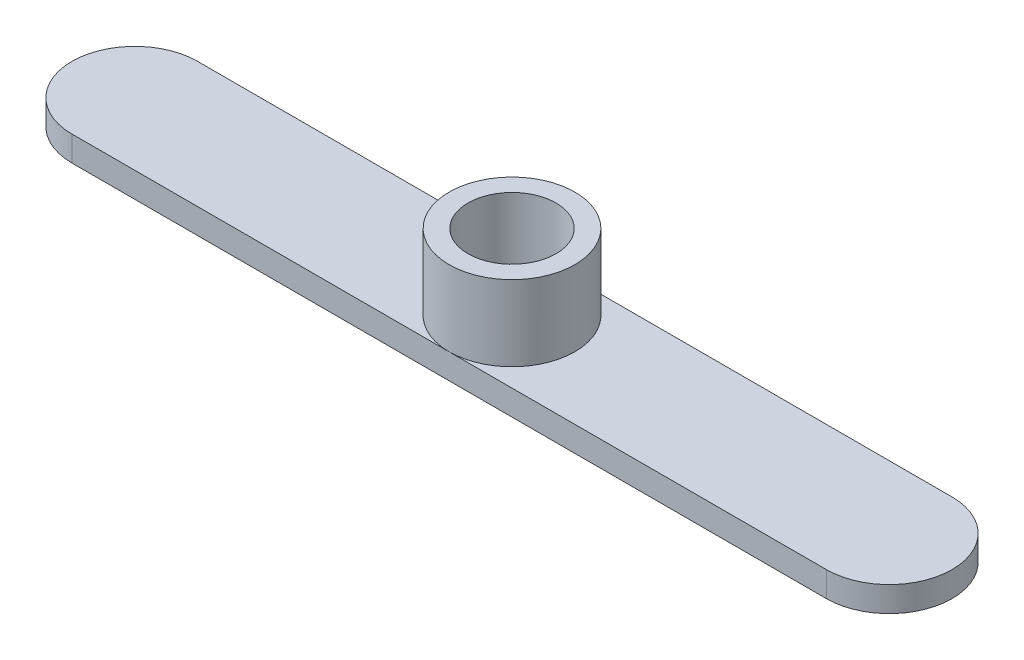
ISO-10303-21;
HEADER;
FILE_DESCRIPTION(('STEP AP214'),'2;1');
FILE_NAME('part.step','',(''),(''),'','','');
FILE_SCHEMA(('AUTOMOTIVE_DESIGN { 1 0 10303 214 1 1 1 1 }'));
ENDSEC;
DATA;
#1=APPLICATION_CONTEXT('core data for automotive mechanical design processes');
#2=APPLICATION_PROTOCOL_DEFINITION('international standard','automotive_design',2000,#1);
#3=PRODUCT_CONTEXT('',#1,'mechanical');
#4=PRODUCT('Part','Part','',(#3));
#5=PRODUCT_RELATED_PRODUCT_CATEGORY('part','',(#4));
#6=PRODUCT_DEFINITION_FORMATION('','',#4);
#7=PRODUCT_DEFINITION_CONTEXT('part definition',#1,'design');
#8=PRODUCT_DEFINITION('design','',#6,#7);
#9=PRODUCT_DEFINITION_SHAPE('','',#8);
#10=(LENGTH_UNIT() NAMED_UNIT(*) SI_UNIT(.MILLI.,.METRE.));
#11=(NAMED_UNIT(*) PLANE_ANGLE_UNIT() SI_UNIT($,.RADIAN.));
#12=(NAMED_UNIT(*) SI_UNIT($,.STERADIAN.) SOLID_ANGLE_UNIT());
#13=UNCERTAINTY_MEASURE_WITH_UNIT(LENGTH_MEASURE(1.E-05),#10,'distance_accuracy_value','');
#14=(GEOMETRIC_REPRESENTATION_CONTEXT(3) GLOBAL_UNCERTAINTY_ASSIGNED_CONTEXT((#13)) GLOBAL_UNIT_ASSIGNED_CONTEXT((#10,
#11,#12)) REPRESENTATION_CONTEXT('',''));
#15=CARTESIAN_POINT('',(0.,0.,0.));
#16=DIRECTION('',(0.,0.,1.));
#17=DIRECTION('',(1.,0.,0.));
#18=AXIS2_PLACEMENT_3D('',#15,#16,#17);
#19=CARTESIAN_POINT('',(15.,1.,0.));
#20=DIRECTION('',(0.,1.,0.));
#21=DIRECTION('',(0.,0.,1.));
#22=AXIS2_PLACEMENT_3D('',#19,#20,#21);
#23=PLANE('',#22);
#24=DIRECTION('',(1.,0.,0.));
#25=VECTOR('',#24,1.);
#26=CARTESIAN_POINT('',(-15.,1.,2.5));
#27=LINE('',#26,#25);
#28=CARTESIAN_POINT('',(-15.,1.,2.5));
#29=VERTEX_POINT('',#28);
#30=CARTESIAN_POINT('',(0.,1.,2.5));
#31=VERTEX_POINT('',#30);
#32=EDGE_CURVE('E103',#29,#31,#27,.T.);
#33=ORIENTED_EDGE('',*,*,#32,.T.);
#34=CARTESIAN_POINT('',(0.,1.,0.));
#35=DIRECTION('',(0.,1.,0.));
#36=DIRECTION('',(0.,0.,1.));
#37=AXIS2_PLACEMENT_3D('',#34,#35,#36);
#38=CIRCLE('',#37,2.5);
#39=CARTESIAN_POINT('',(0.,1.,-2.5));
#40=VERTEX_POINT('',#39);
#41=EDGE_CURVE('E52',#31,#40,#38,.F.);
#42=ORIENTED_EDGE('',*,*,#41,.T.);
#43=DIRECTION('',(-1.,0.,0.));
#44=VECTOR('',#43,1.);
#45=CARTESIAN_POINT('',(-15.,1.,-2.5));
#46=LINE('',#45,#44);
#47=CARTESIAN_POINT('',(-15.,1.,-2.5));
#48=VERTEX_POINT('',#47);
#49=EDGE_CURVE('E100',#40,#48,#46,.T.);
#50=ORIENTED_EDGE('',*,*,#49,.T.);
#51=CARTESIAN_POINT('',(-15.,1.,0.));
#52=DIRECTION('',(0.,1.,0.));
#53=DIRECTION('',(0.,0.,1.));
#54=AXIS2_PLACEMENT_3D('',#51,#52,#53);
#55=CIRCLE('',#54,2.5);
#56=EDGE_CURVE('E114',#48,#29,#55,.T.);
#57=ORIENTED_EDGE('',*,*,#56,.T.);
#58=EDGE_LOOP('',(#33,#42,#50,#57));
#59=FACE_BOUND('',#58,.T.);
#60=ADVANCED_FACE('F36',(#59),#23,.T.);
#61=CARTESIAN_POINT('',(15.,1.,0.));
#62=DIRECTION('',(0.,-1.,0.));
#63=DIRECTION('',(0.,0.,-1.));
#64=AXIS2_PLACEMENT_3D('',#61,#62,#63);
#65=CYLINDRICAL_SURFACE('',#64,2.5);
#66=CARTESIAN_POINT('',(15.,0.,0.));
#67=DIRECTION('',(0.,1.,0.));
#68=DIRECTION('',(0.,0.,1.));
#69=AXIS2_PLACEMENT_3D('',#66,#67,#68);
#70=CIRCLE('',#69,2.5);
#71=CARTESIAN_POINT('',(15.,0.,2.5));
#72=VERTEX_POINT('',#71);
#73=CARTESIAN_POINT('',(15.,0.,-2.5));
#74=VERTEX_POINT('',#73);
#75=EDGE_CURVE('E104',#72,#74,#70,.T.);
#76=ORIENTED_EDGE('',*,*,#75,.T.);
#77=DIRECTION('',(0.,-1.,0.));
#78=VECTOR('',#77,1.);
#79=CARTESIAN_POINT('',(15.,1.,-2.5));
#80=LINE('',#79,#78);
#81=CARTESIAN_POINT('',(15.,1.,-2.5));
#82=VERTEX_POINT('',#81);
#83=EDGE_CURVE('E45',#82,#74,#80,.T.);
#84=ORIENTED_EDGE('',*,*,#83,.F.);
#85=CARTESIAN_POINT('',(15.,1.,0.));
#86=DIRECTION('',(0.,1.,0.));
#87=DIRECTION('',(0.,0.,1.));
#88=AXIS2_PLACEMENT_3D('',#85,#86,#87);
#89=CIRCLE('',#88,2.5);
#90=CARTESIAN_POINT('',(15.,1.,2.5));
#91=VERTEX_POINT('',#90);
#92=EDGE_CURVE('E109',#91,#82,#89,.T.);
#93=ORIENTED_EDGE('',*,*,#92,.F.);
#94=DIRECTION('',(0.,-1.,0.));
#95=VECTOR('',#94,1.);
#96=CARTESIAN_POINT('',(15.,1.,2.5));
#97=LINE('',#96,#95);
#98=EDGE_CURVE('E119',#91,#72,#97,.T.);
#99=ORIENTED_EDGE('',*,*,#98,.T.);
#100=EDGE_LOOP('',(#76,#84,#93,#99));
#101=FACE_BOUND('',#100,.T.);
#102=ADVANCED_FACE('F38',(#101),#65,.T.);
#103=CARTESIAN_POINT('',(-15.,1.,-2.5));
#104=DIRECTION('',(0.,0.,1.));
#105=DIRECTION('',(1.,0.,0.));
#106=AXIS2_PLACEMENT_3D('',#103,#104,#105);
#107=PLANE('',#106);
#108=DIRECTION('',(-1.,0.,0.));
#109=VECTOR('',#108,1.);
#110=CARTESIAN_POINT('',(-15.,0.,-2.5));
#111=LINE('',#110,#109);
#112=CARTESIAN_POINT('',(-15.,0.,-2.5));
#113=VERTEX_POINT('',#112);
#114=EDGE_CURVE('E122',#74,#113,#111,.T.);
#115=ORIENTED_EDGE('',*,*,#114,.T.);
#116=DIRECTION('',(0.,-1.,0.));
#117=VECTOR('',#116,1.);
#118=CARTESIAN_POINT('',(-15.,1.,-2.5));
#119=LINE('',#118,#117);
#120=EDGE_CURVE('E107',#48,#113,#119,.T.);
#121=ORIENTED_EDGE('',*,*,#120,.F.);
#122=ORIENTED_EDGE('',*,*,#49,.F.);
#123=EDGE_CURVE('E90',#82,#40,#46,.T.);
#124=ORIENTED_EDGE('',*,*,#123,.F.);
#125=ORIENTED_EDGE('',*,*,#83,.T.);
#126=EDGE_LOOP('',(#115,#121,#122,#124,#125));
#127=FACE_BOUND('',#126,.T.);
#128=ADVANCED_FACE('F105',(#127),#107,.F.);
#129=CARTESIAN_POINT('',(-15.,1.,0.));
#130=DIRECTION('',(0.,-1.,0.));
#131=DIRECTION('',(0.,0.,-1.));
#132=AXIS2_PLACEMENT_3D('',#129,#130,#131);
#133=CYLINDRICAL_SURFACE('',#132,2.5);
#134=CARTESIAN_POINT('',(-15.,0.,0.));
#135=DIRECTION('',(0.,1.,0.));
#136=DIRECTION('',(0.,0.,1.));
#137=AXIS2_PLACEMENT_3D('',#134,#135,#136);
#138=CIRCLE('',#137,2.5);
#139=CARTESIAN_POINT('',(-15.,0.,2.5));
#140=VERTEX_POINT('',#139);
#141=EDGE_CURVE('E124',#113,#140,#138,.T.);
#142=ORIENTED_EDGE('',*,*,#141,.T.);
#143=DIRECTION('',(0.,-1.,0.));
#144=VECTOR('',#143,1.);
#145=CARTESIAN_POINT('',(-15.,1.,2.5));
#146=LINE('',#145,#144);
#147=EDGE_CURVE('E128',#29,#140,#146,.T.);
#148=ORIENTED_EDGE('',*,*,#147,.F.);
#149=ORIENTED_EDGE('',*,*,#56,.F.);
#150=ORIENTED_EDGE('',*,*,#120,.T.);
#151=EDGE_LOOP('',(#142,#148,#149,#150));
#152=FACE_BOUND('',#151,.T.);
#153=ADVANCED_FACE('F183',(#152),#133,.T.);
#154=CARTESIAN_POINT('',(-15.,1.,2.5));
#155=DIRECTION('',(0.,0.,-1.));
#156=DIRECTION('',(-1.,0.,0.));
#157=AXIS2_PLACEMENT_3D('',#154,#155,#156);
#158=PLANE('',#157);
#159=DIRECTION('',(1.,0.,0.));
#160=VECTOR('',#159,1.);
#161=CARTESIAN_POINT('',(-15.,0.,2.5));
#162=LINE('',#161,#160);
#163=EDGE_CURVE('E82',#140,#72,#162,.T.);
#164=ORIENTED_EDGE('',*,*,#163,.T.);
#165=ORIENTED_EDGE('',*,*,#98,.F.);
#166=EDGE_CURVE('E60',#31,#91,#27,.T.);
#167=ORIENTED_EDGE('',*,*,#166,.F.);
#168=ORIENTED_EDGE('',*,*,#32,.F.);
#169=ORIENTED_EDGE('',*,*,#147,.T.);
#170=EDGE_LOOP('',(#164,#165,#167,#168,#169));
#171=FACE_BOUND('',#170,.T.);
#172=ADVANCED_FACE('F177',(#171),#158,.F.);
#173=ORIENTED_EDGE('',*,*,#123,.T.);
#174=EDGE_CURVE('E93',#40,#31,#38,.F.);
#175=ORIENTED_EDGE('',*,*,#174,.T.);
#176=ORIENTED_EDGE('',*,*,#166,.T.);
#177=ORIENTED_EDGE('',*,*,#92,.T.);
#178=EDGE_LOOP('',(#173,#175,#176,#177));
#179=FACE_BOUND('',#178,.T.);
#180=ADVANCED_FACE('F111',(#179),#23,.T.);
#181=CARTESIAN_POINT('',(15.,0.,0.));
#182=DIRECTION('',(0.,1.,0.));
#183=DIRECTION('',(0.,0.,1.));
#184=AXIS2_PLACEMENT_3D('',#181,#182,#183);
#185=PLANE('',#184);
#186=CARTESIAN_POINT('',(0.,0.,0.));
#187=DIRECTION('',(0.,1.,0.));
#188=DIRECTION('',(0.,0.,1.));
#189=AXIS2_PLACEMENT_3D('',#186,#187,#188);
#190=CIRCLE('',#189,1.5);
#191=CARTESIAN_POINT('',(0.,0.,1.5));
#192=VERTEX_POINT('',#191);
#193=EDGE_CURVE('E143',#192,#192,#190,.T.);
#194=ORIENTED_EDGE('',*,*,#193,.T.);
#195=EDGE_LOOP('',(#194));
#196=FACE_BOUND('',#195,.T.);
#197=ORIENTED_EDGE('',*,*,#75,.F.);
#198=ORIENTED_EDGE('',*,*,#163,.F.);
#199=ORIENTED_EDGE('',*,*,#141,.F.);
#200=ORIENTED_EDGE('',*,*,#114,.F.);
#201=EDGE_LOOP('',(#197,#198,#199,#200));
#202=FACE_BOUND('',#201,.T.);
#203=ADVANCED_FACE('F165',(#196,#202),#185,.F.);
#204=CARTESIAN_POINT('',(0.,4.,0.));
#205=DIRECTION('',(0.,1.,0.));
#206=DIRECTION('',(0.,0.,1.));
#207=AXIS2_PLACEMENT_3D('',#204,#205,#206);
#208=PLANE('',#207);
#209=CARTESIAN_POINT('',(0.,4.,0.));
#210=DIRECTION('',(0.,1.,0.));
#211=DIRECTION('',(0.,0.,1.));
#212=AXIS2_PLACEMENT_3D('',#209,#210,#211);
#213=CIRCLE('',#212,2.5);
#214=CARTESIAN_POINT('',(0.,4.,2.5));
#215=VERTEX_POINT('',#214);
#216=EDGE_CURVE('E96',#215,#215,#213,.T.);
#217=ORIENTED_EDGE('',*,*,#216,.T.);
#218=EDGE_LOOP('',(#217));
#219=FACE_BOUND('',#218,.T.);
#220=CARTESIAN_POINT('',(0.,4.,0.));
#221=DIRECTION('',(0.,1.,0.));
#222=DIRECTION('',(0.,0.,1.));
#223=AXIS2_PLACEMENT_3D('',#220,#221,#222);
#224=CIRCLE('',#223,1.75);
#225=CARTESIAN_POINT('',(0.,4.,1.75));
#226=VERTEX_POINT('',#225);
#227=EDGE_CURVE('E133',#226,#226,#224,.T.);
#228=ORIENTED_EDGE('',*,*,#227,.F.);
#229=EDGE_LOOP('',(#228));
#230=FACE_BOUND('',#229,.T.);
#231=ADVANCED_FACE('F153',(#219,#230),#208,.T.);
#232=CARTESIAN_POINT('',(0.,4.,0.));
#233=DIRECTION('',(0.,-1.,0.));
#234=DIRECTION('',(0.,0.,-1.));
#235=AXIS2_PLACEMENT_3D('',#232,#233,#234);
#236=CYLINDRICAL_SURFACE('',#235,2.5);
#237=ORIENTED_EDGE('',*,*,#41,.F.);
#238=ORIENTED_EDGE('',*,*,#174,.F.);
#239=EDGE_LOOP('',(#237,#238));
#240=FACE_BOUND('',#239,.T.);
#241=ORIENTED_EDGE('',*,*,#216,.F.);
#242=EDGE_LOOP('',(#241));
#243=FACE_BOUND('',#242,.T.);
#244=ADVANCED_FACE('F94',(#240,#243),#236,.T.);
#245=CARTESIAN_POINT('',(0.,4.,0.));
#246=DIRECTION('',(0.,-1.,0.));
#247=DIRECTION('',(0.,0.,-1.));
#248=AXIS2_PLACEMENT_3D('',#245,#246,#247);
#249=CYLINDRICAL_SURFACE('',#248,1.75);
#250=CARTESIAN_POINT('',(0.,1.,0.));
#251=DIRECTION('',(0.,1.,0.));
#252=DIRECTION('',(0.,0.,1.));
#253=AXIS2_PLACEMENT_3D('',#250,#251,#252);
#254=CIRCLE('',#253,1.75);
#255=CARTESIAN_POINT('',(0.,1.,1.75));
#256=VERTEX_POINT('',#255);
#257=EDGE_CURVE('E11',#256,#256,#254,.F.);
#258=ORIENTED_EDGE('',*,*,#257,.T.);
#259=EDGE_LOOP('',(#258));
#260=FACE_BOUND('',#259,.T.);
#261=ORIENTED_EDGE('',*,*,#227,.T.);
#262=EDGE_LOOP('',(#261));
#263=FACE_BOUND('',#262,.T.);
#264=ADVANCED_FACE('F156',(#260,#263),#249,.F.);
#265=CARTESIAN_POINT('',(0.,1.,0.));
#266=DIRECTION('',(0.,1.,0.));
#267=DIRECTION('',(0.,0.,1.));
#268=AXIS2_PLACEMENT_3D('',#265,#266,#267);
#269=CIRCLE('',#268,1.);
#270=CARTESIAN_POINT('',(0.,1.,1.));
#271=VERTEX_POINT('',#270);
#272=EDGE_CURVE('E131',#271,#271,#269,.F.);
#273=ORIENTED_EDGE('',*,*,#272,.T.);
#274=EDGE_LOOP('',(#273));
#275=FACE_BOUND('',#274,.T.);
#276=ORIENTED_EDGE('',*,*,#257,.F.);
#277=EDGE_LOOP('',(#276));
#278=FACE_BOUND('',#277,.T.);
#279=ADVANCED_FACE('F162',(#275,#278),#23,.T.);
#280=CARTESIAN_POINT('',(0.,4.,0.));
#281=DIRECTION('',(0.,-1.,0.));
#282=DIRECTION('',(0.,0.,-1.));
#283=AXIS2_PLACEMENT_3D('',#280,#281,#282);
#284=CYLINDRICAL_SURFACE('',#283,1.);
#285=CARTESIAN_POINT('',(0.,0.5,0.));
#286=DIRECTION('',(0.,1.,0.));
#287=DIRECTION('',(0.,0.,1.));
#288=AXIS2_PLACEMENT_3D('',#285,#286,#287);
#289=CIRCLE('',#288,1.);
#290=CARTESIAN_POINT('',(0.,0.5,1.));
#291=VERTEX_POINT('',#290);
#292=EDGE_CURVE('E40',#291,#291,#289,.T.);
#293=ORIENTED_EDGE('',*,*,#292,.F.);
#294=EDGE_LOOP('',(#293));
#295=FACE_BOUND('',#294,.T.);
#296=ORIENTED_EDGE('',*,*,#272,.F.);
#297=EDGE_LOOP('',(#296));
#298=FACE_BOUND('',#297,.T.);
#299=ADVANCED_FACE('F175',(#295,#298),#284,.F.);
#300=CARTESIAN_POINT('',(0.,0.5,0.));
#301=DIRECTION('',(0.,-1.,0.));
#302=DIRECTION('',(0.,0.,-1.));
#303=AXIS2_PLACEMENT_3D('',#300,#301,#302);
#304=CYLINDRICAL_SURFACE('',#303,1.5);
#305=CARTESIAN_POINT('',(0.,0.5,0.));
#306=DIRECTION('',(0.,1.,0.));
#307=DIRECTION('',(0.,0.,1.));
#308=AXIS2_PLACEMENT_3D('',#305,#306,#307);
#309=CIRCLE('',#308,1.5);
#310=CARTESIAN_POINT('',(0.,0.5,1.5));
#311=VERTEX_POINT('',#310);
#312=EDGE_CURVE('E139',#311,#311,#309,.T.);
#313=ORIENTED_EDGE('',*,*,#312,.T.);
#314=EDGE_LOOP('',(#313));
#315=FACE_BOUND('',#314,.T.);
#316=ORIENTED_EDGE('',*,*,#193,.F.);
#317=EDGE_LOOP('',(#316));
#318=FACE_BOUND('',#317,.T.);
#319=ADVANCED_FACE('F235',(#315,#318),#304,.F.);
#320=CARTESIAN_POINT('',(0.,0.5,0.));
#321=DIRECTION('',(0.,1.,0.));
#322=DIRECTION('',(0.,0.,1.));
#323=AXIS2_PLACEMENT_3D('',#320,#321,#322);
#324=PLANE('',#323);
#325=ORIENTED_EDGE('',*,*,#292,.T.);
#326=EDGE_LOOP('',(#325));
#327=FACE_BOUND('',#326,.T.);
#328=ORIENTED_EDGE('',*,*,#312,.F.);
#329=EDGE_LOOP('',(#328));
#330=FACE_BOUND('',#329,.T.);
#331=ADVANCED_FACE('F245',(#327,#330),#324,.F.);
#332=CLOSED_SHELL('',(#60,#102,#128,#153,#172,#180,#203,#231,#244,#264,#279,#299,#319,#331));
#333=MANIFOLD_SOLID_BREP('B2',#332);
#334=ADVANCED_BREP_SHAPE_REPRESENTATION('',(#18,#333),#14);
#335=SHAPE_DEFINITION_REPRESENTATION(#9,#334);
ENDSEC;
END-ISO-10303-21;
